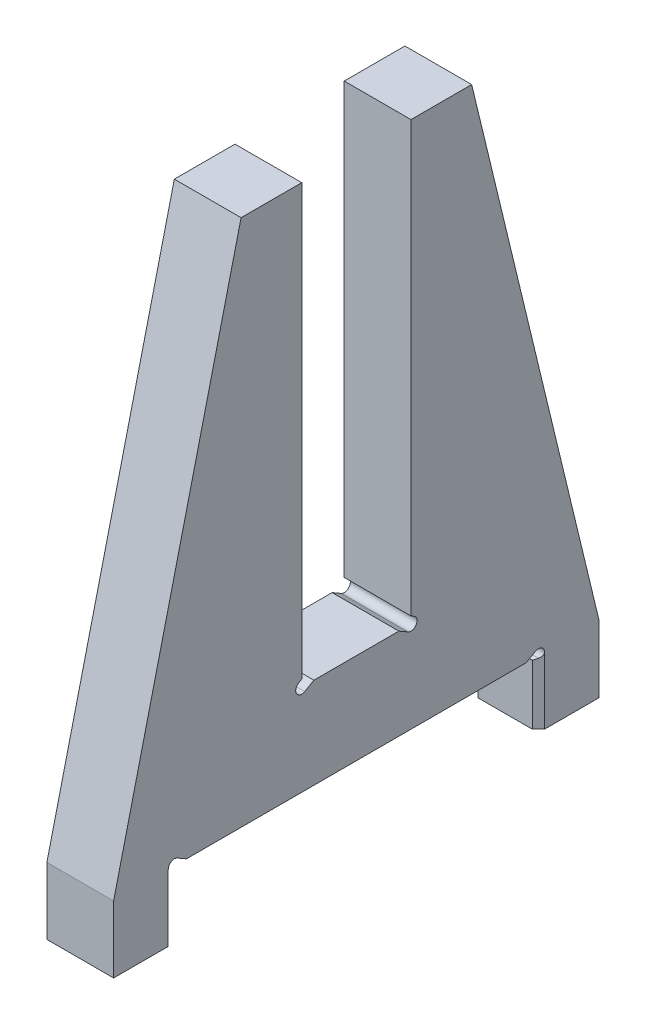
ISO-10303-21;
HEADER;
FILE_DESCRIPTION(('STEP AP214'),'2;1');
FILE_NAME('part.step','',(''),(''),'','','');
FILE_SCHEMA(('AUTOMOTIVE_DESIGN { 1 0 10303 214 1 1 1 1 }'));
ENDSEC;
DATA;
#1=APPLICATION_CONTEXT('core data for automotive mechanical design processes');
#2=APPLICATION_PROTOCOL_DEFINITION('international standard','automotive_design',2000,#1);
#3=PRODUCT_CONTEXT('',#1,'mechanical');
#4=PRODUCT('Part','Part','',(#3));
#5=PRODUCT_RELATED_PRODUCT_CATEGORY('part','',(#4));
#6=PRODUCT_DEFINITION_FORMATION('','',#4);
#7=PRODUCT_DEFINITION_CONTEXT('part definition',#1,'design');
#8=PRODUCT_DEFINITION('design','',#6,#7);
#9=PRODUCT_DEFINITION_SHAPE('','',#8);
#10=(LENGTH_UNIT() NAMED_UNIT(*) SI_UNIT(.MILLI.,.METRE.));
#11=(NAMED_UNIT(*) PLANE_ANGLE_UNIT() SI_UNIT($,.RADIAN.));
#12=(NAMED_UNIT(*) SI_UNIT($,.STERADIAN.) SOLID_ANGLE_UNIT());
#13=UNCERTAINTY_MEASURE_WITH_UNIT(LENGTH_MEASURE(1.E-05),#10,'distance_accuracy_value','');
#14=(GEOMETRIC_REPRESENTATION_CONTEXT(3) GLOBAL_UNCERTAINTY_ASSIGNED_CONTEXT((#13)) GLOBAL_UNIT_ASSIGNED_CONTEXT((#10,
#11,#12)) REPRESENTATION_CONTEXT('',''));
#15=CARTESIAN_POINT('',(0.,0.,0.));
#16=DIRECTION('',(0.,0.,1.));
#17=DIRECTION('',(1.,0.,0.));
#18=AXIS2_PLACEMENT_3D('',#15,#16,#17);
#19=CARTESIAN_POINT('',(11.,1.39188541197532,28.));
#20=DIRECTION('',(0.,0.866025403784438,-0.500000000000002));
#21=DIRECTION('',(0.,0.500000000000002,0.866025403784438));
#22=AXIS2_PLACEMENT_3D('',#19,#20,#21);
#23=PLANE('',#22);
#24=DIRECTION('',(0.,-0.500000000000002,-0.866025403784438));
#25=VECTOR('',#24,1.);
#26=CARTESIAN_POINT('',(0.,1.39188541197532,28.));
#27=LINE('',#26,#25);
#28=CARTESIAN_POINT('',(0.,2.25791081575977,29.5));
#29=VERTEX_POINT('',#28);
#30=CARTESIAN_POINT('',(0.,1.39188541197532,28.));
#31=VERTEX_POINT('',#30);
#32=EDGE_CURVE('E690',#29,#31,#27,.T.);
#33=ORIENTED_EDGE('',*,*,#32,.T.);
#34=DIRECTION('',(-1.,0.,0.));
#35=VECTOR('',#34,1.);
#36=CARTESIAN_POINT('',(11.,1.39188541197532,28.));
#37=LINE('',#36,#35);
#38=CARTESIAN_POINT('',(11.,1.39188541197532,28.));
#39=VERTEX_POINT('',#38);
#40=EDGE_CURVE('E663',#39,#31,#37,.T.);
#41=ORIENTED_EDGE('',*,*,#40,.F.);
#42=DIRECTION('',(0.,-0.500000000000002,-0.866025403784438));
#43=VECTOR('',#42,1.);
#44=CARTESIAN_POINT('',(11.,1.39188541197532,28.));
#45=LINE('',#44,#43);
#46=CARTESIAN_POINT('',(11.,2.25791081575977,29.5));
#47=VERTEX_POINT('',#46);
#48=EDGE_CURVE('E673',#47,#39,#45,.T.);
#49=ORIENTED_EDGE('',*,*,#48,.F.);
#50=DIRECTION('',(-1.,0.,0.));
#51=VECTOR('',#50,1.);
#52=CARTESIAN_POINT('',(11.,2.25791081575977,29.5));
#53=LINE('',#52,#51);
#54=EDGE_CURVE('E841',#47,#29,#53,.T.);
#55=ORIENTED_EDGE('',*,*,#54,.T.);
#56=EDGE_LOOP('',(#33,#41,#49,#55));
#57=FACE_BOUND('',#56,.T.);
#58=ADVANCED_FACE('F459',(#57),#23,.F.);
#59=CARTESIAN_POINT('',(11.,1.39188541197533,-28.));
#60=DIRECTION('',(0.,1.,0.));
#61=DIRECTION('',(0.,0.,1.));
#62=AXIS2_PLACEMENT_3D('',#59,#60,#61);
#63=PLANE('',#62);
#64=DIRECTION('',(0.,0.,-1.));
#65=VECTOR('',#64,1.);
#66=CARTESIAN_POINT('',(0.,1.39188541197533,-28.));
#67=LINE('',#66,#65);
#68=CARTESIAN_POINT('',(0.,1.39188541197533,-28.));
#69=VERTEX_POINT('',#68);
#70=EDGE_CURVE('E931',#31,#69,#67,.T.);
#71=ORIENTED_EDGE('',*,*,#70,.T.);
#72=DIRECTION('',(-1.,0.,0.));
#73=VECTOR('',#72,1.);
#74=CARTESIAN_POINT('',(11.,1.39188541197533,-28.));
#75=LINE('',#74,#73);
#76=CARTESIAN_POINT('',(11.,1.39188541197533,-28.));
#77=VERTEX_POINT('',#76);
#78=EDGE_CURVE('E670',#77,#69,#75,.T.);
#79=ORIENTED_EDGE('',*,*,#78,.F.);
#80=DIRECTION('',(0.,0.,-1.));
#81=VECTOR('',#80,1.);
#82=CARTESIAN_POINT('',(11.,1.39188541197533,-28.));
#83=LINE('',#82,#81);
#84=EDGE_CURVE('E662',#39,#77,#83,.T.);
#85=ORIENTED_EDGE('',*,*,#84,.F.);
#86=ORIENTED_EDGE('',*,*,#40,.T.);
#87=EDGE_LOOP('',(#71,#79,#85,#86));
#88=FACE_BOUND('',#87,.T.);
#89=ADVANCED_FACE('F661',(#88),#63,.F.);
#90=CARTESIAN_POINT('',(11.,1.39188541197533,-28.));
#91=DIRECTION('',(0.,0.866025403784438,0.500000000000002));
#92=DIRECTION('',(0.,-0.500000000000002,0.866025403784438));
#93=AXIS2_PLACEMENT_3D('',#90,#91,#92);
#94=PLANE('',#93);
#95=DIRECTION('',(0.,0.500000000000002,-0.866025403784438));
#96=VECTOR('',#95,1.);
#97=CARTESIAN_POINT('',(0.,1.39188541197533,-28.));
#98=LINE('',#97,#96);
#99=CARTESIAN_POINT('',(0.,2.25791081575978,-29.5));
#100=VERTEX_POINT('',#99);
#101=EDGE_CURVE('E792',#69,#100,#98,.T.);
#102=ORIENTED_EDGE('',*,*,#101,.T.);
#103=DIRECTION('',(-1.,0.,0.));
#104=VECTOR('',#103,1.);
#105=CARTESIAN_POINT('',(11.,2.25791081575978,-29.5));
#106=LINE('',#105,#104);
#107=CARTESIAN_POINT('',(11.,2.25791081575978,-29.5));
#108=VERTEX_POINT('',#107);
#109=EDGE_CURVE('E696',#108,#100,#106,.T.);
#110=ORIENTED_EDGE('',*,*,#109,.F.);
#111=DIRECTION('',(0.,0.500000000000002,-0.866025403784438));
#112=VECTOR('',#111,1.);
#113=CARTESIAN_POINT('',(11.,1.39188541197533,-28.));
#114=LINE('',#113,#112);
#115=EDGE_CURVE('E675',#77,#108,#114,.T.);
#116=ORIENTED_EDGE('',*,*,#115,.F.);
#117=ORIENTED_EDGE('',*,*,#78,.T.);
#118=EDGE_LOOP('',(#102,#110,#116,#117));
#119=FACE_BOUND('',#118,.T.);
#120=ADVANCED_FACE('F998',(#119),#94,.F.);
#121=CARTESIAN_POINT('',(11.,1.39188541197535,-30.));
#122=DIRECTION('',(-1.,0.,0.));
#123=DIRECTION('',(0.,0.,1.));
#124=AXIS2_PLACEMENT_3D('',#121,#122,#123);
#125=CYLINDRICAL_SURFACE('',#124,0.999999999999984);
#126=CARTESIAN_POINT('',(0.,1.39188541197535,-30.));
#127=DIRECTION('',(-1.,0.,0.));
#128=DIRECTION('',(0.,0.,1.));
#129=AXIS2_PLACEMENT_3D('',#126,#127,#128);
#130=CIRCLE('',#129,0.999999999999984);
#131=CARTESIAN_POINT('',(0.,1.39188541197535,-31.));
#132=VERTEX_POINT('',#131);
#133=EDGE_CURVE('E782',#100,#132,#130,.T.);
#134=ORIENTED_EDGE('',*,*,#133,.T.);
#135=CARTESIAN_POINT('',(1.,1.39188541197535,-30.));
#136=DIRECTION('',(0.707106781186547,0.,-0.707106781186547));
#137=DIRECTION('',(-0.707106781186548,0.,-0.707106781186548));
#138=AXIS2_PLACEMENT_3D('',#135,#136,#137);
#139=ELLIPSE('',#138,1.41421356237307,0.999999999999984);
#140=CARTESIAN_POINT('',(0.5,0.525860008190937,-30.5));
#141=VERTEX_POINT('',#140);
#142=EDGE_CURVE('E483',#132,#141,#139,.F.);
#143=ORIENTED_EDGE('',*,*,#142,.T.);
#144=DIRECTION('',(-1.,0.,0.));
#145=VECTOR('',#144,1.);
#146=CARTESIAN_POINT('',(11.,0.525860008190937,-30.5));
#147=LINE('',#146,#145);
#148=CARTESIAN_POINT('',(10.5,0.525860008190937,-30.5));
#149=VERTEX_POINT('',#148);
#150=EDGE_CURVE('E758',#149,#141,#147,.T.);
#151=ORIENTED_EDGE('',*,*,#150,.F.);
#152=CARTESIAN_POINT('',(10.,1.39188541197535,-30.));
#153=DIRECTION('',(0.707106781186547,0.,0.707106781186547));
#154=DIRECTION('',(-0.707106781186548,0.,0.707106781186548));
#155=AXIS2_PLACEMENT_3D('',#152,#153,#154);
#156=ELLIPSE('',#155,1.41421356237307,0.999999999999984);
#157=CARTESIAN_POINT('',(11.,1.39188541197535,-31.));
#158=VERTEX_POINT('',#157);
#159=EDGE_CURVE('E480',#149,#158,#156,.T.);
#160=ORIENTED_EDGE('',*,*,#159,.T.);
#161=CARTESIAN_POINT('',(11.,1.39188541197535,-30.));
#162=DIRECTION('',(-1.,0.,0.));
#163=DIRECTION('',(0.,0.,1.));
#164=AXIS2_PLACEMENT_3D('',#161,#162,#163);
#165=CIRCLE('',#164,0.999999999999984);
#166=EDGE_CURVE('E930',#108,#158,#165,.T.);
#167=ORIENTED_EDGE('',*,*,#166,.F.);
#168=ORIENTED_EDGE('',*,*,#109,.T.);
#169=EDGE_LOOP('',(#134,#143,#151,#160,#167,#168));
#170=FACE_BOUND('',#169,.T.);
#171=ADVANCED_FACE('F926',(#170),#125,.F.);
#172=CARTESIAN_POINT('',(11.,0.525860008190937,-30.5));
#173=DIRECTION('',(0.,-0.866025403784438,-0.500000000000002));
#174=DIRECTION('',(0.,0.500000000000002,-0.866025403784438));
#175=AXIS2_PLACEMENT_3D('',#172,#173,#174);
#176=PLANE('',#175);
#177=ORIENTED_EDGE('',*,*,#150,.T.);
#178=DIRECTION('',(-0.654653670707977,0.377964473009229,-0.654653670707977));
#179=VECTOR('',#178,1.);
#180=CARTESIAN_POINT('',(1.,0.23718487359612,-30.));
#181=LINE('',#180,#179);
#182=CARTESIAN_POINT('',(1.,0.23718487359612,-30.));
#183=VERTEX_POINT('',#182);
#184=EDGE_CURVE('E468',#141,#183,#181,.F.);
#185=ORIENTED_EDGE('',*,*,#184,.T.);
#186=DIRECTION('',(-1.,0.,0.));
#187=VECTOR('',#186,1.);
#188=CARTESIAN_POINT('',(11.,0.23718487359612,-30.));
#189=LINE('',#188,#187);
#190=CARTESIAN_POINT('',(10.,0.23718487359612,-30.));
#191=VERTEX_POINT('',#190);
#192=EDGE_CURVE('E756',#191,#183,#189,.T.);
#193=ORIENTED_EDGE('',*,*,#192,.F.);
#194=DIRECTION('',(0.654653670707977,0.377964473009229,-0.654653670707977));
#195=VECTOR('',#194,1.);
#196=CARTESIAN_POINT('',(11.1428571428571,0.897013752669977,-31.1428571428571));
#197=LINE('',#196,#195);
#198=EDGE_CURVE('E747',#191,#149,#197,.T.);
#199=ORIENTED_EDGE('',*,*,#198,.T.);
#200=EDGE_LOOP('',(#177,#185,#193,#199));
#201=FACE_BOUND('',#200,.T.);
#202=ADVANCED_FACE('F752',(#201),#176,.F.);
#203=CARTESIAN_POINT('',(11.,0.23718487359612,-30.));
#204=DIRECTION('',(0.,0.,-1.));
#205=DIRECTION('',(-1.,0.,0.));
#206=AXIS2_PLACEMENT_3D('',#203,#204,#205);
#207=PLANE('',#206);
#208=ORIENTED_EDGE('',*,*,#192,.T.);
#209=DIRECTION('',(0.,-1.,0.));
#210=VECTOR('',#209,1.);
#211=CARTESIAN_POINT('',(1.,0.23718487359612,-30.));
#212=LINE('',#211,#210);
#213=CARTESIAN_POINT('',(1.,-9.60811458802466,-30.));
#214=VERTEX_POINT('',#213);
#215=EDGE_CURVE('E728',#183,#214,#212,.T.);
#216=ORIENTED_EDGE('',*,*,#215,.T.);
#217=DIRECTION('',(-1.,0.,0.));
#218=VECTOR('',#217,1.);
#219=CARTESIAN_POINT('',(11.,-9.60811458802466,-30.));
#220=LINE('',#219,#218);
#221=CARTESIAN_POINT('',(10.,-9.60811458802466,-30.));
#222=VERTEX_POINT('',#221);
#223=EDGE_CURVE('E770',#222,#214,#220,.T.);
#224=ORIENTED_EDGE('',*,*,#223,.F.);
#225=DIRECTION('',(0.,1.,0.));
#226=VECTOR('',#225,1.);
#227=CARTESIAN_POINT('',(10.,0.23718487359612,-30.));
#228=LINE('',#227,#226);
#229=EDGE_CURVE('E730',#222,#191,#228,.T.);
#230=ORIENTED_EDGE('',*,*,#229,.T.);
#231=EDGE_LOOP('',(#208,#216,#224,#230));
#232=FACE_BOUND('',#231,.T.);
#233=ADVANCED_FACE('F765',(#232),#207,.F.);
#234=CARTESIAN_POINT('',(11.,-9.60811458802466,-30.));
#235=DIRECTION('',(0.,1.,0.));
#236=DIRECTION('',(0.,0.,1.));
#237=AXIS2_PLACEMENT_3D('',#234,#235,#236);
#238=PLANE('',#237);
#239=ORIENTED_EDGE('',*,*,#223,.T.);
#240=DIRECTION('',(0.707106781186548,0.,0.707106781186548));
#241=VECTOR('',#240,1.);
#242=CARTESIAN_POINT('',(1.,-9.60811458802466,-30.));
#243=LINE('',#242,#241);
#244=CARTESIAN_POINT('',(0.,-9.60811458802466,-31.));
#245=VERTEX_POINT('',#244);
#246=EDGE_CURVE('E740',#214,#245,#243,.F.);
#247=ORIENTED_EDGE('',*,*,#246,.T.);
#248=DIRECTION('',(0.,0.,-1.));
#249=VECTOR('',#248,1.);
#250=CARTESIAN_POINT('',(0.,-9.60811458802466,-30.));
#251=LINE('',#250,#249);
#252=CARTESIAN_POINT('',(0.,-9.60811458802467,-40.));
#253=VERTEX_POINT('',#252);
#254=EDGE_CURVE('E773',#245,#253,#251,.T.);
#255=ORIENTED_EDGE('',*,*,#254,.T.);
#256=DIRECTION('',(-1.,0.,0.));
#257=VECTOR('',#256,1.);
#258=CARTESIAN_POINT('',(11.,-9.60811458802467,-40.));
#259=LINE('',#258,#257);
#260=CARTESIAN_POINT('',(11.,-9.60811458802467,-40.));
#261=VERTEX_POINT('',#260);
#262=EDGE_CURVE('E920',#261,#253,#259,.T.);
#263=ORIENTED_EDGE('',*,*,#262,.F.);
#264=DIRECTION('',(0.,0.,-1.));
#265=VECTOR('',#264,1.);
#266=CARTESIAN_POINT('',(11.,-9.60811458802466,-30.));
#267=LINE('',#266,#265);
#268=CARTESIAN_POINT('',(11.,-9.60811458802466,-31.));
#269=VERTEX_POINT('',#268);
#270=EDGE_CURVE('E988',#269,#261,#267,.T.);
#271=ORIENTED_EDGE('',*,*,#270,.F.);
#272=DIRECTION('',(-0.707106781186548,0.,0.707106781186548));
#273=VECTOR('',#272,1.);
#274=CARTESIAN_POINT('',(11.,-9.60811458802466,-31.));
#275=LINE('',#274,#273);
#276=EDGE_CURVE('E733',#269,#222,#275,.T.);
#277=ORIENTED_EDGE('',*,*,#276,.T.);
#278=EDGE_LOOP('',(#239,#247,#255,#263,#271,#277));
#279=FACE_BOUND('',#278,.T.);
#280=ADVANCED_FACE('F774',(#279),#238,.F.);
#281=CARTESIAN_POINT('',(11.,-9.60811458802467,-40.));
#282=DIRECTION('',(0.,0.,1.));
#283=DIRECTION('',(1.,0.,0.));
#284=AXIS2_PLACEMENT_3D('',#281,#282,#283);
#285=PLANE('',#284);
#286=DIRECTION('',(0.,1.,0.));
#287=VECTOR('',#286,1.);
#288=CARTESIAN_POINT('',(0.,-9.60811458802467,-40.));
#289=LINE('',#288,#287);
#290=CARTESIAN_POINT('',(0.,1.39188541197533,-40.));
#291=VERTEX_POINT('',#290);
#292=EDGE_CURVE('E785',#253,#291,#289,.T.);
#293=ORIENTED_EDGE('',*,*,#292,.T.);
#294=DIRECTION('',(-1.,0.,0.));
#295=VECTOR('',#294,1.);
#296=CARTESIAN_POINT('',(11.,1.39188541197533,-40.));
#297=LINE('',#296,#295);
#298=CARTESIAN_POINT('',(11.,1.39188541197533,-40.));
#299=VERTEX_POINT('',#298);
#300=EDGE_CURVE('E913',#299,#291,#297,.T.);
#301=ORIENTED_EDGE('',*,*,#300,.F.);
#302=DIRECTION('',(0.,1.,0.));
#303=VECTOR('',#302,1.);
#304=CARTESIAN_POINT('',(11.,-9.60811458802467,-40.));
#305=LINE('',#304,#303);
#306=EDGE_CURVE('E990',#261,#299,#305,.T.);
#307=ORIENTED_EDGE('',*,*,#306,.F.);
#308=ORIENTED_EDGE('',*,*,#262,.T.);
#309=EDGE_LOOP('',(#293,#301,#307,#308));
#310=FACE_BOUND('',#309,.T.);
#311=ADVANCED_FACE('F1043',(#310),#285,.F.);
#312=CARTESIAN_POINT('',(11.,1.39188541197533,-40.));
#313=DIRECTION('',(0.,-0.234640533103897,0.972082208573287));
#314=DIRECTION('',(0.,-0.972082208573287,-0.234640533103897));
#315=AXIS2_PLACEMENT_3D('',#312,#313,#314);
#316=PLANE('',#315);
#317=DIRECTION('',(0.,0.972082208573287,0.234640533103897));
#318=VECTOR('',#317,1.);
#319=CARTESIAN_POINT('',(0.,1.39188541197533,-40.));
#320=LINE('',#319,#318);
#321=CARTESIAN_POINT('',(0.,88.3918854119753,-19.));
#322=VERTEX_POINT('',#321);
#323=EDGE_CURVE('E789',#291,#322,#320,.T.);
#324=ORIENTED_EDGE('',*,*,#323,.T.);
#325=DIRECTION('',(-1.,0.,0.));
#326=VECTOR('',#325,1.);
#327=CARTESIAN_POINT('',(11.,88.3918854119753,-19.));
#328=LINE('',#327,#326);
#329=CARTESIAN_POINT('',(11.,88.3918854119753,-19.));
#330=VERTEX_POINT('',#329);
#331=EDGE_CURVE('E908',#330,#322,#328,.T.);
#332=ORIENTED_EDGE('',*,*,#331,.F.);
#333=DIRECTION('',(0.,0.972082208573287,0.234640533103897));
#334=VECTOR('',#333,1.);
#335=CARTESIAN_POINT('',(11.,1.39188541197533,-40.));
#336=LINE('',#335,#334);
#337=EDGE_CURVE('E984',#299,#330,#336,.T.);
#338=ORIENTED_EDGE('',*,*,#337,.F.);
#339=ORIENTED_EDGE('',*,*,#300,.T.);
#340=EDGE_LOOP('',(#324,#332,#338,#339));
#341=FACE_BOUND('',#340,.T.);
#342=ADVANCED_FACE('F1049',(#341),#316,.F.);
#343=CARTESIAN_POINT('',(11.,88.3918854119753,-8.99999999999999));
#344=DIRECTION('',(0.,-1.,0.));
#345=DIRECTION('',(0.,0.,-1.));
#346=AXIS2_PLACEMENT_3D('',#343,#344,#345);
#347=PLANE('',#346);
#348=DIRECTION('',(0.,0.,1.));
#349=VECTOR('',#348,1.);
#350=CARTESIAN_POINT('',(0.,88.3918854119753,-8.99999999999999));
#351=LINE('',#350,#349);
#352=CARTESIAN_POINT('',(0.,88.3918854119753,-8.99999999999999));
#353=VERTEX_POINT('',#352);
#354=EDGE_CURVE('E796',#322,#353,#351,.T.);
#355=ORIENTED_EDGE('',*,*,#354,.T.);
#356=DIRECTION('',(-1.,0.,0.));
#357=VECTOR('',#356,1.);
#358=CARTESIAN_POINT('',(11.,88.3918854119753,-8.99999999999999));
#359=LINE('',#358,#357);
#360=CARTESIAN_POINT('',(11.,88.3918854119753,-8.99999999999999));
#361=VERTEX_POINT('',#360);
#362=EDGE_CURVE('E903',#361,#353,#359,.T.);
#363=ORIENTED_EDGE('',*,*,#362,.F.);
#364=DIRECTION('',(0.,0.,1.));
#365=VECTOR('',#364,1.);
#366=CARTESIAN_POINT('',(11.,88.3918854119753,-8.99999999999999));
#367=LINE('',#366,#365);
#368=EDGE_CURVE('E982',#330,#361,#367,.T.);
#369=ORIENTED_EDGE('',*,*,#368,.F.);
#370=ORIENTED_EDGE('',*,*,#331,.T.);
#371=EDGE_LOOP('',(#355,#363,#369,#370));
#372=FACE_BOUND('',#371,.T.);
#373=ADVANCED_FACE('F1055',(#372),#347,.F.);
#374=CARTESIAN_POINT('',(11.,17.5465859503546,-8.99999999999999));
#375=DIRECTION('',(0.,0.,-1.));
#376=DIRECTION('',(-1.,0.,0.));
#377=AXIS2_PLACEMENT_3D('',#374,#375,#376);
#378=PLANE('',#377);
#379=DIRECTION('',(0.,-1.,0.));
#380=VECTOR('',#379,1.);
#381=CARTESIAN_POINT('',(0.,17.5465859503546,-8.99999999999999));
#382=LINE('',#381,#380);
#383=CARTESIAN_POINT('',(0.,17.5465859503546,-8.99999999999999));
#384=VERTEX_POINT('',#383);
#385=EDGE_CURVE('E797',#353,#384,#382,.T.);
#386=ORIENTED_EDGE('',*,*,#385,.T.);
#387=DIRECTION('',(-1.,0.,0.));
#388=VECTOR('',#387,1.);
#389=CARTESIAN_POINT('',(11.,17.5465859503546,-8.99999999999999));
#390=LINE('',#389,#388);
#391=CARTESIAN_POINT('',(11.,17.5465859503546,-8.99999999999999));
#392=VERTEX_POINT('',#391);
#393=EDGE_CURVE('E902',#392,#384,#390,.T.);
#394=ORIENTED_EDGE('',*,*,#393,.F.);
#395=DIRECTION('',(0.,-1.,0.));
#396=VECTOR('',#395,1.);
#397=CARTESIAN_POINT('',(11.,17.5465859503546,-8.99999999999999));
#398=LINE('',#397,#396);
#399=EDGE_CURVE('E978',#361,#392,#398,.T.);
#400=ORIENTED_EDGE('',*,*,#399,.F.);
#401=ORIENTED_EDGE('',*,*,#362,.T.);
#402=EDGE_LOOP('',(#386,#394,#400,#401));
#403=FACE_BOUND('',#402,.T.);
#404=ADVANCED_FACE('F1056',(#403),#378,.F.);
#405=CARTESIAN_POINT('',(11.,17.2579108157598,-9.5));
#406=DIRECTION('',(0.,0.866025403784439,-0.499999999999999));
#407=DIRECTION('',(0.,0.499999999999999,0.866025403784439));
#408=AXIS2_PLACEMENT_3D('',#405,#406,#407);
#409=PLANE('',#408);
#410=DIRECTION('',(0.,-0.499999999999999,-0.866025403784439));
#411=VECTOR('',#410,1.);
#412=CARTESIAN_POINT('',(0.,17.2579108157598,-9.5));
#413=LINE('',#412,#411);
#414=CARTESIAN_POINT('',(0.,17.2579108157598,-9.5));
#415=VERTEX_POINT('',#414);
#416=EDGE_CURVE('E803',#384,#415,#413,.T.);
#417=ORIENTED_EDGE('',*,*,#416,.T.);
#418=DIRECTION('',(-1.,0.,0.));
#419=VECTOR('',#418,1.);
#420=CARTESIAN_POINT('',(11.,17.2579108157598,-9.5));
#421=LINE('',#420,#419);
#422=CARTESIAN_POINT('',(11.,17.2579108157598,-9.5));
#423=VERTEX_POINT('',#422);
#424=EDGE_CURVE('E900',#423,#415,#421,.T.);
#425=ORIENTED_EDGE('',*,*,#424,.F.);
#426=DIRECTION('',(0.,-0.499999999999999,-0.866025403784439));
#427=VECTOR('',#426,1.);
#428=CARTESIAN_POINT('',(11.,17.2579108157598,-9.5));
#429=LINE('',#428,#427);
#430=EDGE_CURVE('E972',#392,#423,#429,.T.);
#431=ORIENTED_EDGE('',*,*,#430,.F.);
#432=ORIENTED_EDGE('',*,*,#393,.T.);
#433=EDGE_LOOP('',(#417,#425,#431,#432));
#434=FACE_BOUND('',#433,.T.);
#435=ADVANCED_FACE('F1063',(#434),#409,.F.);
#436=CARTESIAN_POINT('',(11.,16.3918854119753,-8.99999999999999));
#437=DIRECTION('',(-1.,0.,0.));
#438=DIRECTION('',(0.,0.,1.));
#439=AXIS2_PLACEMENT_3D('',#436,#437,#438);
#440=CYLINDRICAL_SURFACE('',#439,1.);
#441=CARTESIAN_POINT('',(0.,16.3918854119753,-8.99999999999999));
#442=DIRECTION('',(-1.,0.,0.));
#443=DIRECTION('',(0.,0.,1.));
#444=AXIS2_PLACEMENT_3D('',#441,#442,#443);
#445=CIRCLE('',#444,1.);
#446=CARTESIAN_POINT('',(0.,15.5258600081909,-8.49999999999999));
#447=VERTEX_POINT('',#446);
#448=EDGE_CURVE('E807',#415,#447,#445,.T.);
#449=ORIENTED_EDGE('',*,*,#448,.T.);
#450=DIRECTION('',(-1.,0.,0.));
#451=VECTOR('',#450,1.);
#452=CARTESIAN_POINT('',(11.,15.5258600081909,-8.49999999999999));
#453=LINE('',#452,#451);
#454=CARTESIAN_POINT('',(11.,15.5258600081909,-8.49999999999999));
#455=VERTEX_POINT('',#454);
#456=EDGE_CURVE('E893',#455,#447,#453,.T.);
#457=ORIENTED_EDGE('',*,*,#456,.F.);
#458=CARTESIAN_POINT('',(11.,16.3918854119753,-8.99999999999999));
#459=DIRECTION('',(-1.,0.,0.));
#460=DIRECTION('',(0.,0.,1.));
#461=AXIS2_PLACEMENT_3D('',#458,#459,#460);
#462=CIRCLE('',#461,1.);
#463=EDGE_CURVE('E971',#423,#455,#462,.T.);
#464=ORIENTED_EDGE('',*,*,#463,.F.);
#465=ORIENTED_EDGE('',*,*,#424,.T.);
#466=EDGE_LOOP('',(#449,#457,#464,#465));
#467=FACE_BOUND('',#466,.T.);
#468=ADVANCED_FACE('F1070',(#467),#440,.F.);
#469=CARTESIAN_POINT('',(11.,16.3918854119753,-6.99999999999999));
#470=DIRECTION('',(0.,-0.866025403784438,0.5));
#471=DIRECTION('',(0.,-0.5,-0.866025403784438));
#472=AXIS2_PLACEMENT_3D('',#469,#470,#471);
#473=PLANE('',#472);
#474=DIRECTION('',(0.,0.5,0.866025403784438));
#475=VECTOR('',#474,1.);
#476=CARTESIAN_POINT('',(0.,16.3918854119753,-6.99999999999999));
#477=LINE('',#476,#475);
#478=CARTESIAN_POINT('',(0.,16.3918854119753,-6.99999999999999));
#479=VERTEX_POINT('',#478);
#480=EDGE_CURVE('E809',#447,#479,#477,.T.);
#481=ORIENTED_EDGE('',*,*,#480,.T.);
#482=DIRECTION('',(-1.,0.,0.));
#483=VECTOR('',#482,1.);
#484=CARTESIAN_POINT('',(11.,16.3918854119753,-6.99999999999999));
#485=LINE('',#484,#483);
#486=CARTESIAN_POINT('',(11.,16.3918854119753,-6.99999999999999));
#487=VERTEX_POINT('',#486);
#488=EDGE_CURVE('E887',#487,#479,#485,.T.);
#489=ORIENTED_EDGE('',*,*,#488,.F.);
#490=DIRECTION('',(0.,0.5,0.866025403784438));
#491=VECTOR('',#490,1.);
#492=CARTESIAN_POINT('',(11.,16.3918854119753,-6.99999999999999));
#493=LINE('',#492,#491);
#494=EDGE_CURVE('E966',#455,#487,#493,.T.);
#495=ORIENTED_EDGE('',*,*,#494,.F.);
#496=ORIENTED_EDGE('',*,*,#456,.T.);
#497=EDGE_LOOP('',(#481,#489,#495,#496));
#498=FACE_BOUND('',#497,.T.);
#499=ADVANCED_FACE('F1072',(#498),#473,.F.);
#500=CARTESIAN_POINT('',(11.,16.3918854119753,-6.99999999999999));
#501=DIRECTION('',(0.,-1.,0.));
#502=DIRECTION('',(0.,0.,-1.));
#503=AXIS2_PLACEMENT_3D('',#500,#501,#502);
#504=PLANE('',#503);
#505=DIRECTION('',(0.,0.,1.));
#506=VECTOR('',#505,1.);
#507=CARTESIAN_POINT('',(0.,16.3918854119753,-6.99999999999999));
#508=LINE('',#507,#506);
#509=CARTESIAN_POINT('',(0.,16.3918854119753,6.99999999999999));
#510=VERTEX_POINT('',#509);
#511=EDGE_CURVE('E812',#479,#510,#508,.T.);
#512=ORIENTED_EDGE('',*,*,#511,.T.);
#513=DIRECTION('',(-1.,0.,0.));
#514=VECTOR('',#513,1.);
#515=CARTESIAN_POINT('',(11.,16.3918854119753,6.99999999999999));
#516=LINE('',#515,#514);
#517=CARTESIAN_POINT('',(11.,16.3918854119753,6.99999999999999));
#518=VERTEX_POINT('',#517);
#519=EDGE_CURVE('E882',#518,#510,#516,.T.);
#520=ORIENTED_EDGE('',*,*,#519,.F.);
#521=DIRECTION('',(0.,0.,1.));
#522=VECTOR('',#521,1.);
#523=CARTESIAN_POINT('',(11.,16.3918854119753,-6.99999999999999));
#524=LINE('',#523,#522);
#525=EDGE_CURVE('E967',#487,#518,#524,.T.);
#526=ORIENTED_EDGE('',*,*,#525,.F.);
#527=ORIENTED_EDGE('',*,*,#488,.T.);
#528=EDGE_LOOP('',(#512,#520,#526,#527));
#529=FACE_BOUND('',#528,.T.);
#530=ADVANCED_FACE('F1076',(#529),#504,.F.);
#531=CARTESIAN_POINT('',(11.,16.3918854119753,6.99999999999999));
#532=DIRECTION('',(0.,-0.866025403784437,-0.500000000000004));
#533=DIRECTION('',(0.,0.500000000000004,-0.866025403784437));
#534=AXIS2_PLACEMENT_3D('',#531,#532,#533);
#535=PLANE('',#534);
#536=DIRECTION('',(0.,-0.500000000000004,0.866025403784437));
#537=VECTOR('',#536,1.);
#538=CARTESIAN_POINT('',(0.,16.3918854119753,6.99999999999999));
#539=LINE('',#538,#537);
#540=CARTESIAN_POINT('',(0.,15.5258600081909,8.49999999999999));
#541=VERTEX_POINT('',#540);
#542=EDGE_CURVE('E814',#510,#541,#539,.T.);
#543=ORIENTED_EDGE('',*,*,#542,.T.);
#544=DIRECTION('',(-1.,0.,0.));
#545=VECTOR('',#544,1.);
#546=CARTESIAN_POINT('',(11.,15.5258600081909,8.49999999999999));
#547=LINE('',#546,#545);
#548=CARTESIAN_POINT('',(11.,15.5258600081909,8.49999999999999));
#549=VERTEX_POINT('',#548);
#550=EDGE_CURVE('E883',#549,#541,#547,.T.);
#551=ORIENTED_EDGE('',*,*,#550,.F.);
#552=DIRECTION('',(0.,-0.500000000000004,0.866025403784437));
#553=VECTOR('',#552,1.);
#554=CARTESIAN_POINT('',(11.,16.3918854119753,6.99999999999999));
#555=LINE('',#554,#553);
#556=EDGE_CURVE('E962',#518,#549,#555,.T.);
#557=ORIENTED_EDGE('',*,*,#556,.F.);
#558=ORIENTED_EDGE('',*,*,#519,.T.);
#559=EDGE_LOOP('',(#543,#551,#557,#558));
#560=FACE_BOUND('',#559,.T.);
#561=ADVANCED_FACE('F1085',(#560),#535,.F.);
#562=CARTESIAN_POINT('',(11.,16.3918854119753,8.99999999999999));
#563=DIRECTION('',(-1.,0.,0.));
#564=DIRECTION('',(0.,0.,1.));
#565=AXIS2_PLACEMENT_3D('',#562,#563,#564);
#566=CYLINDRICAL_SURFACE('',#565,1.);
#567=CARTESIAN_POINT('',(0.,16.3918854119753,8.99999999999999));
#568=DIRECTION('',(-1.,0.,0.));
#569=DIRECTION('',(0.,0.,-1.));
#570=AXIS2_PLACEMENT_3D('',#567,#568,#569);
#571=CIRCLE('',#570,1.);
#572=CARTESIAN_POINT('',(0.,17.2579108157598,9.5));
#573=VERTEX_POINT('',#572);
#574=EDGE_CURVE('E816',#541,#573,#571,.T.);
#575=ORIENTED_EDGE('',*,*,#574,.T.);
#576=DIRECTION('',(-1.,0.,0.));
#577=VECTOR('',#576,1.);
#578=CARTESIAN_POINT('',(11.,17.2579108157598,9.5));
#579=LINE('',#578,#577);
#580=CARTESIAN_POINT('',(11.,17.2579108157598,9.5));
#581=VERTEX_POINT('',#580);
#582=EDGE_CURVE('E877',#581,#573,#579,.T.);
#583=ORIENTED_EDGE('',*,*,#582,.F.);
#584=CARTESIAN_POINT('',(11.,16.3918854119753,8.99999999999999));
#585=DIRECTION('',(-1.,0.,0.));
#586=DIRECTION('',(0.,0.,-1.));
#587=AXIS2_PLACEMENT_3D('',#584,#585,#586);
#588=CIRCLE('',#587,1.);
#589=EDGE_CURVE('E959',#549,#581,#588,.T.);
#590=ORIENTED_EDGE('',*,*,#589,.F.);
#591=ORIENTED_EDGE('',*,*,#550,.T.);
#592=EDGE_LOOP('',(#575,#583,#590,#591));
#593=FACE_BOUND('',#592,.T.);
#594=ADVANCED_FACE('F1090',(#593),#566,.F.);
#595=CARTESIAN_POINT('',(11.,17.2579108157598,9.5));
#596=DIRECTION('',(0.,0.866025403784439,0.499999999999999));
#597=DIRECTION('',(0.,-0.499999999999999,0.866025403784439));
#598=AXIS2_PLACEMENT_3D('',#595,#596,#597);
#599=PLANE('',#598);
#600=DIRECTION('',(0.,0.499999999999999,-0.866025403784439));
#601=VECTOR('',#600,1.);
#602=CARTESIAN_POINT('',(0.,17.2579108157598,9.5));
#603=LINE('',#602,#601);
#604=CARTESIAN_POINT('',(0.,17.5465859503546,8.99999999999999));
#605=VERTEX_POINT('',#604);
#606=EDGE_CURVE('E821',#573,#605,#603,.T.);
#607=ORIENTED_EDGE('',*,*,#606,.T.);
#608=DIRECTION('',(-1.,0.,0.));
#609=VECTOR('',#608,1.);
#610=CARTESIAN_POINT('',(11.,17.5465859503546,8.99999999999999));
#611=LINE('',#610,#609);
#612=CARTESIAN_POINT('',(11.,17.5465859503546,8.99999999999999));
#613=VERTEX_POINT('',#612);
#614=EDGE_CURVE('E873',#613,#605,#611,.T.);
#615=ORIENTED_EDGE('',*,*,#614,.F.);
#616=DIRECTION('',(0.,0.499999999999999,-0.866025403784439));
#617=VECTOR('',#616,1.);
#618=CARTESIAN_POINT('',(11.,17.2579108157598,9.5));
#619=LINE('',#618,#617);
#620=EDGE_CURVE('E960',#581,#613,#619,.T.);
#621=ORIENTED_EDGE('',*,*,#620,.F.);
#622=ORIENTED_EDGE('',*,*,#582,.T.);
#623=EDGE_LOOP('',(#607,#615,#621,#622));
#624=FACE_BOUND('',#623,.T.);
#625=ADVANCED_FACE('F1092',(#624),#599,.F.);
#626=CARTESIAN_POINT('',(11.,17.5465859503546,8.99999999999999));
#627=DIRECTION('',(0.,0.,1.));
#628=DIRECTION('',(1.,0.,0.));
#629=AXIS2_PLACEMENT_3D('',#626,#627,#628);
#630=PLANE('',#629);
#631=DIRECTION('',(0.,1.,0.));
#632=VECTOR('',#631,1.);
#633=CARTESIAN_POINT('',(0.,17.5465859503546,8.99999999999999));
#634=LINE('',#633,#632);
#635=CARTESIAN_POINT('',(0.,88.3918854119753,8.99999999999999));
#636=VERTEX_POINT('',#635);
#637=EDGE_CURVE('E822',#605,#636,#634,.T.);
#638=ORIENTED_EDGE('',*,*,#637,.T.);
#639=DIRECTION('',(-1.,0.,0.));
#640=VECTOR('',#639,1.);
#641=CARTESIAN_POINT('',(11.,88.3918854119753,8.99999999999999));
#642=LINE('',#641,#640);
#643=CARTESIAN_POINT('',(11.,88.3918854119753,8.99999999999999));
#644=VERTEX_POINT('',#643);
#645=EDGE_CURVE('E867',#644,#636,#642,.T.);
#646=ORIENTED_EDGE('',*,*,#645,.F.);
#647=DIRECTION('',(0.,1.,0.));
#648=VECTOR('',#647,1.);
#649=CARTESIAN_POINT('',(11.,17.5465859503546,8.99999999999999));
#650=LINE('',#649,#648);
#651=EDGE_CURVE('E952',#613,#644,#650,.T.);
#652=ORIENTED_EDGE('',*,*,#651,.F.);
#653=ORIENTED_EDGE('',*,*,#614,.T.);
#654=EDGE_LOOP('',(#638,#646,#652,#653));
#655=FACE_BOUND('',#654,.T.);
#656=ADVANCED_FACE('F1100',(#655),#630,.F.);
#657=CARTESIAN_POINT('',(11.,88.3918854119753,8.99999999999999));
#658=DIRECTION('',(0.,-1.,0.));
#659=DIRECTION('',(0.,0.,-1.));
#660=AXIS2_PLACEMENT_3D('',#657,#658,#659);
#661=PLANE('',#660);
#662=DIRECTION('',(0.,0.,1.));
#663=VECTOR('',#662,1.);
#664=CARTESIAN_POINT('',(0.,88.3918854119753,8.99999999999999));
#665=LINE('',#664,#663);
#666=CARTESIAN_POINT('',(0.,88.3918854119753,19.));
#667=VERTEX_POINT('',#666);
#668=EDGE_CURVE('E830',#636,#667,#665,.T.);
#669=ORIENTED_EDGE('',*,*,#668,.T.);
#670=DIRECTION('',(-1.,0.,0.));
#671=VECTOR('',#670,1.);
#672=CARTESIAN_POINT('',(11.,88.3918854119753,19.));
#673=LINE('',#672,#671);
#674=CARTESIAN_POINT('',(11.,88.3918854119753,19.));
#675=VERTEX_POINT('',#674);
#676=EDGE_CURVE('E862',#675,#667,#673,.T.);
#677=ORIENTED_EDGE('',*,*,#676,.F.);
#678=DIRECTION('',(0.,0.,1.));
#679=VECTOR('',#678,1.);
#680=CARTESIAN_POINT('',(11.,88.3918854119753,8.99999999999999));
#681=LINE('',#680,#679);
#682=EDGE_CURVE('E951',#644,#675,#681,.T.);
#683=ORIENTED_EDGE('',*,*,#682,.F.);
#684=ORIENTED_EDGE('',*,*,#645,.T.);
#685=EDGE_LOOP('',(#669,#677,#683,#684));
#686=FACE_BOUND('',#685,.T.);
#687=ADVANCED_FACE('F1101',(#686),#661,.F.);
#688=CARTESIAN_POINT('',(11.,1.39188541197532,40.));
#689=DIRECTION('',(0.,-0.234640533103897,-0.972082208573287));
#690=DIRECTION('',(0.,0.972082208573287,-0.234640533103897));
#691=AXIS2_PLACEMENT_3D('',#688,#689,#690);
#692=PLANE('',#691);
#693=DIRECTION('',(0.,-0.972082208573287,0.234640533103897));
#694=VECTOR('',#693,1.);
#695=CARTESIAN_POINT('',(0.,1.39188541197532,40.));
#696=LINE('',#695,#694);
#697=CARTESIAN_POINT('',(0.,1.39188541197532,40.));
#698=VERTEX_POINT('',#697);
#699=EDGE_CURVE('E829',#667,#698,#696,.T.);
#700=ORIENTED_EDGE('',*,*,#699,.T.);
#701=DIRECTION('',(-1.,0.,0.));
#702=VECTOR('',#701,1.);
#703=CARTESIAN_POINT('',(11.,1.39188541197532,40.));
#704=LINE('',#703,#702);
#705=CARTESIAN_POINT('',(11.,1.39188541197532,40.));
#706=VERTEX_POINT('',#705);
#707=EDGE_CURVE('E864',#706,#698,#704,.T.);
#708=ORIENTED_EDGE('',*,*,#707,.F.);
#709=DIRECTION('',(0.,-0.972082208573287,0.234640533103897));
#710=VECTOR('',#709,1.);
#711=CARTESIAN_POINT('',(11.,1.39188541197532,40.));
#712=LINE('',#711,#710);
#713=EDGE_CURVE('E946',#675,#706,#712,.T.);
#714=ORIENTED_EDGE('',*,*,#713,.F.);
#715=ORIENTED_EDGE('',*,*,#676,.T.);
#716=EDGE_LOOP('',(#700,#708,#714,#715));
#717=FACE_BOUND('',#716,.T.);
#718=ADVANCED_FACE('F1108',(#717),#692,.F.);
#719=CARTESIAN_POINT('',(11.,-9.60811458802468,40.));
#720=DIRECTION('',(0.,0.,-1.));
#721=DIRECTION('',(-1.,0.,0.));
#722=AXIS2_PLACEMENT_3D('',#719,#720,#721);
#723=PLANE('',#722);
#724=DIRECTION('',(0.,-1.,0.));
#725=VECTOR('',#724,1.);
#726=CARTESIAN_POINT('',(0.,-9.60811458802468,40.));
#727=LINE('',#726,#725);
#728=CARTESIAN_POINT('',(0.,-9.60811458802468,40.));
#729=VERTEX_POINT('',#728);
#730=EDGE_CURVE('E832',#698,#729,#727,.T.);
#731=ORIENTED_EDGE('',*,*,#730,.T.);
#732=DIRECTION('',(-1.,0.,0.));
#733=VECTOR('',#732,1.);
#734=CARTESIAN_POINT('',(11.,-9.60811458802468,40.));
#735=LINE('',#734,#733);
#736=CARTESIAN_POINT('',(11.,-9.60811458802468,40.));
#737=VERTEX_POINT('',#736);
#738=EDGE_CURVE('E860',#737,#729,#735,.T.);
#739=ORIENTED_EDGE('',*,*,#738,.F.);
#740=DIRECTION('',(0.,-1.,0.));
#741=VECTOR('',#740,1.);
#742=CARTESIAN_POINT('',(11.,-9.60811458802468,40.));
#743=LINE('',#742,#741);
#744=EDGE_CURVE('E944',#706,#737,#743,.T.);
#745=ORIENTED_EDGE('',*,*,#744,.F.);
#746=ORIENTED_EDGE('',*,*,#707,.T.);
#747=EDGE_LOOP('',(#731,#739,#745,#746));
#748=FACE_BOUND('',#747,.T.);
#749=ADVANCED_FACE('F1115',(#748),#723,.F.);
#750=CARTESIAN_POINT('',(11.,-9.60811458802467,30.));
#751=DIRECTION('',(0.,1.,0.));
#752=DIRECTION('',(0.,0.,1.));
#753=AXIS2_PLACEMENT_3D('',#750,#751,#752);
#754=PLANE('',#753);
#755=DIRECTION('',(0.,0.,-1.));
#756=VECTOR('',#755,1.);
#757=CARTESIAN_POINT('',(0.,-9.60811458802467,30.));
#758=LINE('',#757,#756);
#759=CARTESIAN_POINT('',(0.,-9.60811458802467,31.));
#760=VERTEX_POINT('',#759);
#761=EDGE_CURVE('E837',#729,#760,#758,.T.);
#762=ORIENTED_EDGE('',*,*,#761,.T.);
#763=DIRECTION('',(-0.707106781186548,0.,0.707106781186548));
#764=VECTOR('',#763,1.);
#765=CARTESIAN_POINT('',(1.,-9.60811458802467,30.));
#766=LINE('',#765,#764);
#767=CARTESIAN_POINT('',(1.,-9.60811458802467,30.));
#768=VERTEX_POINT('',#767);
#769=EDGE_CURVE('E722',#760,#768,#766,.F.);
#770=ORIENTED_EDGE('',*,*,#769,.T.);
#771=DIRECTION('',(-1.,0.,0.));
#772=VECTOR('',#771,1.);
#773=CARTESIAN_POINT('',(11.,-9.60811458802467,30.));
#774=LINE('',#773,#772);
#775=CARTESIAN_POINT('',(10.,-9.60811458802467,30.));
#776=VERTEX_POINT('',#775);
#777=EDGE_CURVE('E853',#776,#768,#774,.T.);
#778=ORIENTED_EDGE('',*,*,#777,.F.);
#779=DIRECTION('',(0.707106781186548,0.,0.707106781186548));
#780=VECTOR('',#779,1.);
#781=CARTESIAN_POINT('',(11.,-9.60811458802467,31.));
#782=LINE('',#781,#780);
#783=CARTESIAN_POINT('',(11.,-9.60811458802467,31.));
#784=VERTEX_POINT('',#783);
#785=EDGE_CURVE('E718',#776,#784,#782,.T.);
#786=ORIENTED_EDGE('',*,*,#785,.T.);
#787=DIRECTION('',(0.,0.,-1.));
#788=VECTOR('',#787,1.);
#789=CARTESIAN_POINT('',(11.,-9.60811458802467,30.));
#790=LINE('',#789,#788);
#791=EDGE_CURVE('E943',#737,#784,#790,.T.);
#792=ORIENTED_EDGE('',*,*,#791,.F.);
#793=ORIENTED_EDGE('',*,*,#738,.T.);
#794=EDGE_LOOP('',(#762,#770,#778,#786,#792,#793));
#795=FACE_BOUND('',#794,.T.);
#796=ADVANCED_FACE('F1117',(#795),#754,.F.);
#797=CARTESIAN_POINT('',(11.,0.237184873596114,30.));
#798=DIRECTION('',(0.,0.,1.));
#799=DIRECTION('',(1.,0.,0.));
#800=AXIS2_PLACEMENT_3D('',#797,#798,#799);
#801=PLANE('',#800);
#802=ORIENTED_EDGE('',*,*,#777,.T.);
#803=DIRECTION('',(0.,1.,0.));
#804=VECTOR('',#803,1.);
#805=CARTESIAN_POINT('',(1.,0.237184873596114,30.));
#806=LINE('',#805,#804);
#807=CARTESIAN_POINT('',(1.,0.237184873596114,30.));
#808=VERTEX_POINT('',#807);
#809=EDGE_CURVE('E692',#768,#808,#806,.T.);
#810=ORIENTED_EDGE('',*,*,#809,.T.);
#811=DIRECTION('',(-1.,0.,0.));
#812=VECTOR('',#811,1.);
#813=CARTESIAN_POINT('',(11.,0.237184873596114,30.));
#814=LINE('',#813,#812);
#815=CARTESIAN_POINT('',(10.,0.237184873596114,30.));
#816=VERTEX_POINT('',#815);
#817=EDGE_CURVE('E847',#816,#808,#814,.T.);
#818=ORIENTED_EDGE('',*,*,#817,.F.);
#819=DIRECTION('',(0.,-1.,0.));
#820=VECTOR('',#819,1.);
#821=CARTESIAN_POINT('',(10.,-9.60811458802467,30.));
#822=LINE('',#821,#820);
#823=EDGE_CURVE('E689',#816,#776,#822,.T.);
#824=ORIENTED_EDGE('',*,*,#823,.T.);
#825=EDGE_LOOP('',(#802,#810,#818,#824));
#826=FACE_BOUND('',#825,.T.);
#827=ADVANCED_FACE('F1133',(#826),#801,.F.);
#828=CARTESIAN_POINT('',(11.,0.52586000819093,30.5));
#829=DIRECTION('',(0.,-0.866025403784438,0.500000000000001));
#830=DIRECTION('',(0.,-0.500000000000001,-0.866025403784438));
#831=AXIS2_PLACEMENT_3D('',#828,#829,#830);
#832=PLANE('',#831);
#833=ORIENTED_EDGE('',*,*,#817,.T.);
#834=DIRECTION('',(0.654653670707977,-0.377964473009228,-0.654653670707977));
#835=VECTOR('',#834,1.);
#836=CARTESIAN_POINT('',(1.,0.237184873596114,30.));
#837=LINE('',#836,#835);
#838=CARTESIAN_POINT('',(0.5,0.52586000819093,30.5));
#839=VERTEX_POINT('',#838);
#840=EDGE_CURVE('E707',#808,#839,#837,.F.);
#841=ORIENTED_EDGE('',*,*,#840,.T.);
#842=DIRECTION('',(-1.,0.,0.));
#843=VECTOR('',#842,1.);
#844=CARTESIAN_POINT('',(11.,0.52586000819093,30.5));
#845=LINE('',#844,#843);
#846=CARTESIAN_POINT('',(10.5,0.52586000819093,30.5));
#847=VERTEX_POINT('',#846);
#848=EDGE_CURVE('E842',#847,#839,#845,.T.);
#849=ORIENTED_EDGE('',*,*,#848,.F.);
#850=DIRECTION('',(-0.654653670707977,-0.377964473009228,-0.654653670707977));
#851=VECTOR('',#850,1.);
#852=CARTESIAN_POINT('',(11.1428571428571,0.89701375266997,31.1428571428571));
#853=LINE('',#852,#851);
#854=EDGE_CURVE('E702',#847,#816,#853,.T.);
#855=ORIENTED_EDGE('',*,*,#854,.T.);
#856=EDGE_LOOP('',(#833,#841,#849,#855));
#857=FACE_BOUND('',#856,.T.);
#858=ADVANCED_FACE('F1130',(#857),#832,.F.);
#859=CARTESIAN_POINT('',(11.,1.39188541197535,30.));
#860=DIRECTION('',(-1.,0.,0.));
#861=DIRECTION('',(0.,0.,1.));
#862=AXIS2_PLACEMENT_3D('',#859,#860,#861);
#863=CYLINDRICAL_SURFACE('',#862,0.999999999999984);
#864=ORIENTED_EDGE('',*,*,#848,.T.);
#865=CARTESIAN_POINT('',(1.,1.39188541197535,30.));
#866=DIRECTION('',(0.707106781186547,0.,0.707106781186547));
#867=DIRECTION('',(-0.707106781186548,0.,0.707106781186548));
#868=AXIS2_PLACEMENT_3D('',#865,#866,#867);
#869=ELLIPSE('',#868,1.41421356237307,0.999999999999984);
#870=CARTESIAN_POINT('',(0.,1.39188541197535,31.));
#871=VERTEX_POINT('',#870);
#872=EDGE_CURVE('E711',#839,#871,#869,.F.);
#873=ORIENTED_EDGE('',*,*,#872,.T.);
#874=CARTESIAN_POINT('',(0.,1.39188541197535,30.));
#875=DIRECTION('',(-1.,0.,0.));
#876=DIRECTION('',(0.,0.,-1.));
#877=AXIS2_PLACEMENT_3D('',#874,#875,#876);
#878=CIRCLE('',#877,0.999999999999984);
#879=EDGE_CURVE('E685',#871,#29,#878,.T.);
#880=ORIENTED_EDGE('',*,*,#879,.T.);
#881=ORIENTED_EDGE('',*,*,#54,.F.);
#882=CARTESIAN_POINT('',(11.,1.39188541197535,30.));
#883=DIRECTION('',(-1.,0.,0.));
#884=DIRECTION('',(0.,0.,-1.));
#885=AXIS2_PLACEMENT_3D('',#882,#883,#884);
#886=CIRCLE('',#885,0.999999999999984);
#887=CARTESIAN_POINT('',(11.,1.39188541197535,31.));
#888=VERTEX_POINT('',#887);
#889=EDGE_CURVE('E679',#888,#47,#886,.T.);
#890=ORIENTED_EDGE('',*,*,#889,.F.);
#891=CARTESIAN_POINT('',(10.,1.39188541197535,30.));
#892=DIRECTION('',(0.707106781186547,0.,-0.707106781186547));
#893=DIRECTION('',(-0.707106781186548,0.,-0.707106781186548));
#894=AXIS2_PLACEMENT_3D('',#891,#892,#893);
#895=ELLIPSE('',#894,1.41421356237307,0.999999999999984);
#896=EDGE_CURVE('E706',#888,#847,#895,.T.);
#897=ORIENTED_EDGE('',*,*,#896,.T.);
#898=EDGE_LOOP('',(#864,#873,#880,#881,#890,#897));
#899=FACE_BOUND('',#898,.T.);
#900=ADVANCED_FACE('F1123',(#899),#863,.F.);
#901=CARTESIAN_POINT('',(11.,1.39188541197535,30.));
#902=DIRECTION('',(1.,0.,0.));
#903=DIRECTION('',(0.,0.,-1.));
#904=AXIS2_PLACEMENT_3D('',#901,#902,#903);
#905=PLANE('',#904);
#906=ORIENTED_EDGE('',*,*,#166,.T.);
#907=DIRECTION('',(0.,-1.,0.));
#908=VECTOR('',#907,1.);
#909=CARTESIAN_POINT('',(11.,-9.60811458802466,-31.));
#910=LINE('',#909,#908);
#911=EDGE_CURVE('E12',#158,#269,#910,.T.);
#912=ORIENTED_EDGE('',*,*,#911,.T.);
#913=ORIENTED_EDGE('',*,*,#270,.T.);
#914=ORIENTED_EDGE('',*,*,#306,.T.);
#915=ORIENTED_EDGE('',*,*,#337,.T.);
#916=ORIENTED_EDGE('',*,*,#368,.T.);
#917=ORIENTED_EDGE('',*,*,#399,.T.);
#918=ORIENTED_EDGE('',*,*,#430,.T.);
#919=ORIENTED_EDGE('',*,*,#463,.T.);
#920=ORIENTED_EDGE('',*,*,#494,.T.);
#921=ORIENTED_EDGE('',*,*,#525,.T.);
#922=ORIENTED_EDGE('',*,*,#556,.T.);
#923=ORIENTED_EDGE('',*,*,#589,.T.);
#924=ORIENTED_EDGE('',*,*,#620,.T.);
#925=ORIENTED_EDGE('',*,*,#651,.T.);
#926=ORIENTED_EDGE('',*,*,#682,.T.);
#927=ORIENTED_EDGE('',*,*,#713,.T.);
#928=ORIENTED_EDGE('',*,*,#744,.T.);
#929=ORIENTED_EDGE('',*,*,#791,.T.);
#930=DIRECTION('',(0.,1.,0.));
#931=VECTOR('',#930,1.);
#932=CARTESIAN_POINT('',(11.,0.237184873596114,31.));
#933=LINE('',#932,#931);
#934=EDGE_CURVE('E724',#784,#888,#933,.T.);
#935=ORIENTED_EDGE('',*,*,#934,.T.);
#936=ORIENTED_EDGE('',*,*,#889,.T.);
#937=ORIENTED_EDGE('',*,*,#48,.T.);
#938=ORIENTED_EDGE('',*,*,#84,.T.);
#939=ORIENTED_EDGE('',*,*,#115,.T.);
#940=EDGE_LOOP('',(#906,#912,#913,#914,#915,#916,#917,#918,#919,#920,#921,#922,#923,#924,#925,
#926,#927,#928,#929,#935,#936,#937,#938,#939));
#941=FACE_BOUND('',#940,.T.);
#942=ADVANCED_FACE('F677',(#941),#905,.T.);
#943=CARTESIAN_POINT('',(0.,1.39188541197535,30.));
#944=DIRECTION('',(1.,0.,0.));
#945=DIRECTION('',(0.,0.,-1.));
#946=AXIS2_PLACEMENT_3D('',#943,#944,#945);
#947=PLANE('',#946);
#948=ORIENTED_EDGE('',*,*,#254,.F.);
#949=DIRECTION('',(0.,1.,0.));
#950=VECTOR('',#949,1.);
#951=CARTESIAN_POINT('',(0.,1.39188541197535,-31.));
#952=LINE('',#951,#950);
#953=EDGE_CURVE('E739',#245,#132,#952,.T.);
#954=ORIENTED_EDGE('',*,*,#953,.T.);
#955=ORIENTED_EDGE('',*,*,#133,.F.);
#956=ORIENTED_EDGE('',*,*,#101,.F.);
#957=ORIENTED_EDGE('',*,*,#70,.F.);
#958=ORIENTED_EDGE('',*,*,#32,.F.);
#959=ORIENTED_EDGE('',*,*,#879,.F.);
#960=DIRECTION('',(0.,-1.,0.));
#961=VECTOR('',#960,1.);
#962=CARTESIAN_POINT('',(0.,1.39188541197535,31.));
#963=LINE('',#962,#961);
#964=EDGE_CURVE('E712',#871,#760,#963,.T.);
#965=ORIENTED_EDGE('',*,*,#964,.T.);
#966=ORIENTED_EDGE('',*,*,#761,.F.);
#967=ORIENTED_EDGE('',*,*,#730,.F.);
#968=ORIENTED_EDGE('',*,*,#699,.F.);
#969=ORIENTED_EDGE('',*,*,#668,.F.);
#970=ORIENTED_EDGE('',*,*,#637,.F.);
#971=ORIENTED_EDGE('',*,*,#606,.F.);
#972=ORIENTED_EDGE('',*,*,#574,.F.);
#973=ORIENTED_EDGE('',*,*,#542,.F.);
#974=ORIENTED_EDGE('',*,*,#511,.F.);
#975=ORIENTED_EDGE('',*,*,#480,.F.);
#976=ORIENTED_EDGE('',*,*,#448,.F.);
#977=ORIENTED_EDGE('',*,*,#416,.F.);
#978=ORIENTED_EDGE('',*,*,#385,.F.);
#979=ORIENTED_EDGE('',*,*,#354,.F.);
#980=ORIENTED_EDGE('',*,*,#323,.F.);
#981=ORIENTED_EDGE('',*,*,#292,.F.);
#982=EDGE_LOOP('',(#948,#954,#955,#956,#957,#958,#959,#965,#966,#967,#968,#969,#970,#971,#972,
#973,#974,#975,#976,#977,#978,#979,#980,#981));
#983=FACE_BOUND('',#982,.T.);
#984=ADVANCED_FACE('F778',(#983),#947,.F.);
#985=CARTESIAN_POINT('',(1.,0.237184873596114,30.));
#986=DIRECTION('',(0.707106781186547,0.,0.707106781186547));
#987=DIRECTION('',(0.,1.,0.));
#988=AXIS2_PLACEMENT_3D('',#985,#986,#987);
#989=PLANE('',#988);
#990=ORIENTED_EDGE('',*,*,#769,.F.);
#991=ORIENTED_EDGE('',*,*,#964,.F.);
#992=ORIENTED_EDGE('',*,*,#872,.F.);
#993=ORIENTED_EDGE('',*,*,#840,.F.);
#994=ORIENTED_EDGE('',*,*,#809,.F.);
#995=EDGE_LOOP('',(#990,#991,#992,#993,#994));
#996=FACE_BOUND('',#995,.T.);
#997=ADVANCED_FACE('F1012',(#996),#989,.F.);
#998=CARTESIAN_POINT('',(11.,1.39188541197535,31.));
#999=DIRECTION('',(0.707106781186547,0.,-0.707106781186547));
#1000=DIRECTION('',(0.,-1.,0.));
#1001=AXIS2_PLACEMENT_3D('',#998,#999,#1000);
#1002=PLANE('',#1001);
#1003=ORIENTED_EDGE('',*,*,#785,.F.);
#1004=ORIENTED_EDGE('',*,*,#823,.F.);
#1005=ORIENTED_EDGE('',*,*,#854,.F.);
#1006=ORIENTED_EDGE('',*,*,#896,.F.);
#1007=ORIENTED_EDGE('',*,*,#934,.F.);
#1008=EDGE_LOOP('',(#1003,#1004,#1005,#1006,#1007));
#1009=FACE_BOUND('',#1008,.T.);
#1010=ADVANCED_FACE('F1021',(#1009),#1002,.T.);
#1011=CARTESIAN_POINT('',(1.,0.23718487359612,-30.));
#1012=DIRECTION('',(0.707106781186547,0.,-0.707106781186547));
#1013=DIRECTION('',(0.,-1.,0.));
#1014=AXIS2_PLACEMENT_3D('',#1011,#1012,#1013);
#1015=PLANE('',#1014);
#1016=ORIENTED_EDGE('',*,*,#142,.F.);
#1017=ORIENTED_EDGE('',*,*,#953,.F.);
#1018=ORIENTED_EDGE('',*,*,#246,.F.);
#1019=ORIENTED_EDGE('',*,*,#215,.F.);
#1020=ORIENTED_EDGE('',*,*,#184,.F.);
#1021=EDGE_LOOP('',(#1016,#1017,#1018,#1019,#1020));
#1022=FACE_BOUND('',#1021,.T.);
#1023=ADVANCED_FACE('F768',(#1022),#1015,.F.);
#1024=CARTESIAN_POINT('',(11.,1.39188541197535,-31.));
#1025=DIRECTION('',(0.707106781186547,0.,0.707106781186547));
#1026=DIRECTION('',(0.,1.,0.));
#1027=AXIS2_PLACEMENT_3D('',#1024,#1025,#1026);
#1028=PLANE('',#1027);
#1029=ORIENTED_EDGE('',*,*,#198,.F.);
#1030=ORIENTED_EDGE('',*,*,#229,.F.);
#1031=ORIENTED_EDGE('',*,*,#276,.F.);
#1032=ORIENTED_EDGE('',*,*,#911,.F.);
#1033=ORIENTED_EDGE('',*,*,#159,.F.);
#1034=EDGE_LOOP('',(#1029,#1030,#1031,#1032,#1033));
#1035=FACE_BOUND('',#1034,.T.);
#1036=ADVANCED_FACE('F463',(#1035),#1028,.T.);
#1037=CLOSED_SHELL('',(#58,#89,#120,#171,#202,#233,#280,#311,#342,#373,#404,#435,#468,#499,#530,
#561,#594,#625,#656,#687,#718,#749,#796,#827,#858,#900,#942,#984,#997,#1010,#1023,#1036));
#1038=MANIFOLD_SOLID_BREP('B2',#1037);
#1039=ADVANCED_BREP_SHAPE_REPRESENTATION('',(#18,#1038),#14);
#1040=SHAPE_DEFINITION_REPRESENTATION(#9,#1039);
ENDSEC;
END-ISO-10303-21;
